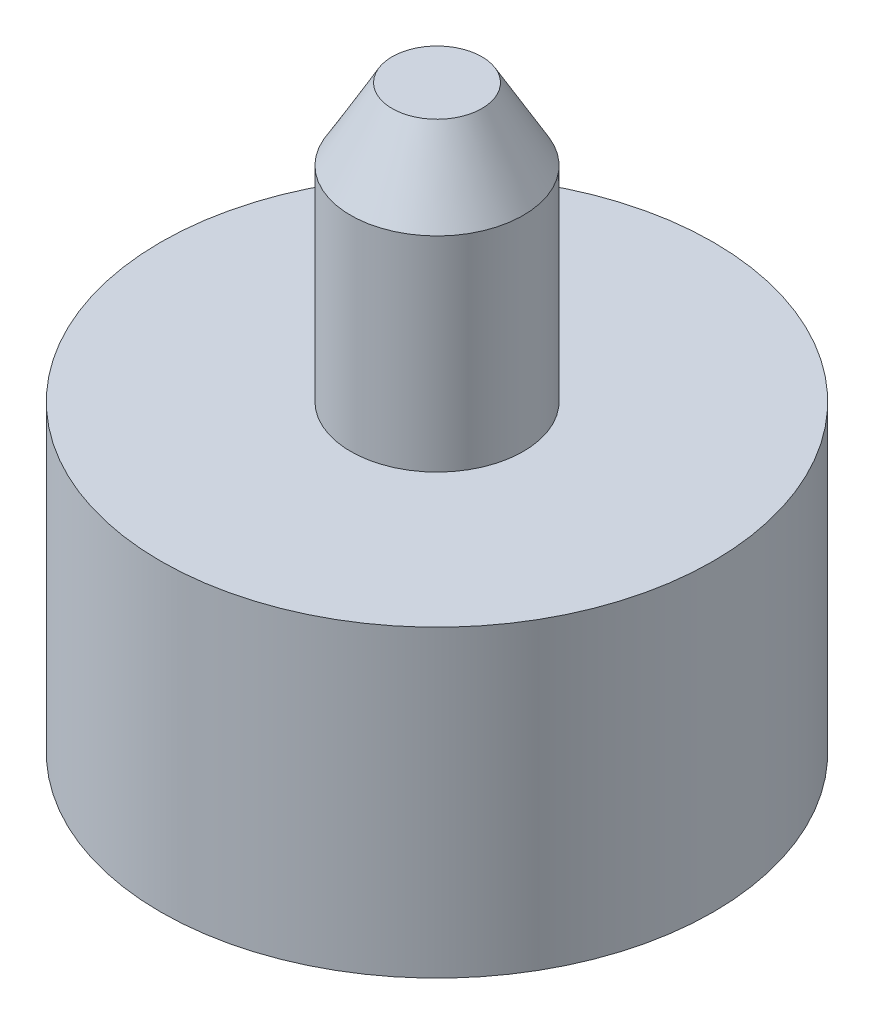
ISO-10303-21;
HEADER;
FILE_DESCRIPTION(('STEP AP214'),'2;1');
FILE_NAME('part.step','',(''),(''),'','','');
FILE_SCHEMA(('AUTOMOTIVE_DESIGN { 1 0 10303 214 1 1 1 1 }'));
ENDSEC;
DATA;
#1=APPLICATION_CONTEXT('core data for automotive mechanical design processes');
#2=APPLICATION_PROTOCOL_DEFINITION('international standard','automotive_design',2000,#1);
#3=PRODUCT_CONTEXT('',#1,'mechanical');
#4=PRODUCT('Part','Part','',(#3));
#5=PRODUCT_RELATED_PRODUCT_CATEGORY('part','',(#4));
#6=PRODUCT_DEFINITION_FORMATION('','',#4);
#7=PRODUCT_DEFINITION_CONTEXT('part definition',#1,'design');
#8=PRODUCT_DEFINITION('design','',#6,#7);
#9=PRODUCT_DEFINITION_SHAPE('','',#8);
#10=(LENGTH_UNIT() NAMED_UNIT(*) SI_UNIT(.MILLI.,.METRE.));
#11=(NAMED_UNIT(*) PLANE_ANGLE_UNIT() SI_UNIT($,.RADIAN.));
#12=(NAMED_UNIT(*) SI_UNIT($,.STERADIAN.) SOLID_ANGLE_UNIT());
#13=UNCERTAINTY_MEASURE_WITH_UNIT(LENGTH_MEASURE(1.E-05),#10,'distance_accuracy_value','');
#14=(GEOMETRIC_REPRESENTATION_CONTEXT(3) GLOBAL_UNCERTAINTY_ASSIGNED_CONTEXT((#13)) GLOBAL_UNIT_ASSIGNED_CONTEXT((#10,
#11,#12)) REPRESENTATION_CONTEXT('',''));
#15=CARTESIAN_POINT('',(0.,0.,0.));
#16=DIRECTION('',(0.,0.,1.));
#17=DIRECTION('',(1.,0.,0.));
#18=AXIS2_PLACEMENT_3D('',#15,#16,#17);
#19=CARTESIAN_POINT('',(0.,44.,0.));
#20=DIRECTION('',(0.,-1.,0.));
#21=DIRECTION('',(0.,0.,-1.));
#22=AXIS2_PLACEMENT_3D('',#19,#20,#21);
#23=CYLINDRICAL_SURFACE('',#22,40.);
#24=CARTESIAN_POINT('',(0.,44.,0.));
#25=DIRECTION('',(0.,1.,0.));
#26=DIRECTION('',(0.,0.,1.));
#27=AXIS2_PLACEMENT_3D('',#24,#25,#26);
#28=CIRCLE('',#27,40.);
#29=CARTESIAN_POINT('',(0.,44.,40.));
#30=VERTEX_POINT('',#29);
#31=EDGE_CURVE('E47',#30,#30,#28,.T.);
#32=ORIENTED_EDGE('',*,*,#31,.F.);
#33=EDGE_LOOP('',(#32));
#34=FACE_BOUND('',#33,.T.);
#35=CARTESIAN_POINT('',(0.,0.,0.));
#36=DIRECTION('',(0.,1.,0.));
#37=DIRECTION('',(0.,0.,1.));
#38=AXIS2_PLACEMENT_3D('',#35,#36,#37);
#39=CIRCLE('',#38,40.);
#40=CARTESIAN_POINT('',(0.,0.,40.));
#41=VERTEX_POINT('',#40);
#42=EDGE_CURVE('E50',#41,#41,#39,.T.);
#43=ORIENTED_EDGE('',*,*,#42,.T.);
#44=EDGE_LOOP('',(#43));
#45=FACE_BOUND('',#44,.T.);
#46=ADVANCED_FACE('F32',(#34,#45),#23,.T.);
#47=CARTESIAN_POINT('',(0.,44.,0.));
#48=DIRECTION('',(0.,1.,0.));
#49=DIRECTION('',(0.,0.,1.));
#50=AXIS2_PLACEMENT_3D('',#47,#48,#49);
#51=PLANE('',#50);
#52=CARTESIAN_POINT('',(0.,44.,0.));
#53=DIRECTION('',(0.,1.,0.));
#54=DIRECTION('',(0.,0.,1.));
#55=AXIS2_PLACEMENT_3D('',#52,#53,#54);
#56=CIRCLE('',#55,12.5);
#57=CARTESIAN_POINT('',(0.,44.,-12.5));
#58=VERTEX_POINT('',#57);
#59=EDGE_CURVE('E43',#58,#58,#56,.T.);
#60=ORIENTED_EDGE('',*,*,#59,.F.);
#61=EDGE_LOOP('',(#60));
#62=FACE_BOUND('',#61,.T.);
#63=ORIENTED_EDGE('',*,*,#31,.T.);
#64=EDGE_LOOP('',(#63));
#65=FACE_BOUND('',#64,.T.);
#66=ADVANCED_FACE('F56',(#62,#65),#51,.T.);
#67=CARTESIAN_POINT('',(0.,0.,0.));
#68=DIRECTION('',(0.,1.,0.));
#69=DIRECTION('',(0.,0.,1.));
#70=AXIS2_PLACEMENT_3D('',#67,#68,#69);
#71=PLANE('',#70);
#72=ORIENTED_EDGE('',*,*,#42,.F.);
#73=EDGE_LOOP('',(#72));
#74=FACE_BOUND('',#73,.T.);
#75=ADVANCED_FACE('F62',(#74),#71,.F.);
#76=CARTESIAN_POINT('',(0.,84.,0.));
#77=DIRECTION('',(0.,-1.,0.));
#78=DIRECTION('',(0.,0.,-1.));
#79=AXIS2_PLACEMENT_3D('',#76,#77,#78);
#80=CYLINDRICAL_SURFACE('',#79,12.5);
#81=CARTESIAN_POINT('',(0.,73.6076951545867,0.));
#82=DIRECTION('',(0.,-1.,0.));
#83=DIRECTION('',(0.,0.,-1.));
#84=AXIS2_PLACEMENT_3D('',#81,#82,#83);
#85=CIRCLE('',#84,12.5);
#86=CARTESIAN_POINT('',(0.,73.6076951545867,-12.5));
#87=VERTEX_POINT('',#86);
#88=EDGE_CURVE('E39',#87,#87,#85,.T.);
#89=CARTESIAN_POINT('',(0.,73.6076951545867,-12.5));
#90=CARTESIAN_POINT('',(0.,73.2992816633931,-12.5));
#91=CARTESIAN_POINT('',(0.,72.9908681721995,-12.5));
#92=CARTESIAN_POINT('',(0.,72.3740411898122,-12.5));
#93=CARTESIAN_POINT('',(0.,72.0656276986186,-12.5));
#94=CARTESIAN_POINT('',(0.,71.4488007162314,-12.5));
#95=CARTESIAN_POINT('',(0.,71.1403872250378,-12.5));
#96=CARTESIAN_POINT('',(0.,70.5235602426506,-12.5));
#97=CARTESIAN_POINT('',(0.,70.215146751457,-12.5));
#98=CARTESIAN_POINT('',(0.,69.5983197690698,-12.5));
#99=CARTESIAN_POINT('',(0.,69.2899062778761,-12.5));
#100=CARTESIAN_POINT('',(0.,68.6730792954889,-12.5));
#101=CARTESIAN_POINT('',(0.,68.3646658042953,-12.5));
#102=CARTESIAN_POINT('',(0.,67.7478388219081,-12.5));
#103=CARTESIAN_POINT('',(0.,67.4394253307145,-12.5));
#104=CARTESIAN_POINT('',(0.,66.8225983483272,-12.5));
#105=CARTESIAN_POINT('',(0.,66.5141848571336,-12.5));
#106=CARTESIAN_POINT('',(0.,65.8973578747464,-12.5));
#107=CARTESIAN_POINT('',(0.,65.5889443835528,-12.5));
#108=CARTESIAN_POINT('',(0.,64.9721174011656,-12.5));
#109=CARTESIAN_POINT('',(0.,64.663703909972,-12.5));
#110=CARTESIAN_POINT('',(0.,64.0468769275847,-12.5));
#111=CARTESIAN_POINT('',(0.,63.7384634363911,-12.5));
#112=CARTESIAN_POINT('',(0.,63.1216364540039,-12.5));
#113=CARTESIAN_POINT('',(0.,62.8132229628103,-12.5));
#114=CARTESIAN_POINT('',(0.,62.1963959804231,-12.5));
#115=CARTESIAN_POINT('',(0.,61.8879824892295,-12.5));
#116=CARTESIAN_POINT('',(0.,61.2711555068422,-12.5));
#117=CARTESIAN_POINT('',(0.,60.9627420156486,-12.5));
#118=CARTESIAN_POINT('',(0.,60.3459150332614,-12.5));
#119=CARTESIAN_POINT('',(0.,60.0375015420678,-12.5));
#120=CARTESIAN_POINT('',(0.,59.4206745596806,-12.5));
#121=CARTESIAN_POINT('',(0.,59.112261068487,-12.5));
#122=CARTESIAN_POINT('',(0.,58.4954340860997,-12.5));
#123=CARTESIAN_POINT('',(0.,58.1870205949061,-12.5));
#124=CARTESIAN_POINT('',(0.,57.5701936125189,-12.5));
#125=CARTESIAN_POINT('',(0.,57.2617801213253,-12.5));
#126=CARTESIAN_POINT('',(0.,56.6449531389381,-12.5));
#127=CARTESIAN_POINT('',(0.,56.3365396477445,-12.5));
#128=CARTESIAN_POINT('',(0.,55.7197126653572,-12.5));
#129=CARTESIAN_POINT('',(0.,55.4112991741636,-12.5));
#130=CARTESIAN_POINT('',(0.,54.7944721917764,-12.5));
#131=CARTESIAN_POINT('',(0.,54.4860587005828,-12.5));
#132=CARTESIAN_POINT('',(0.,53.8692317181956,-12.5));
#133=CARTESIAN_POINT('',(0.,53.5608182270019,-12.5));
#134=CARTESIAN_POINT('',(0.,52.9439912446147,-12.5));
#135=CARTESIAN_POINT('',(0.,52.6355777534211,-12.5));
#136=CARTESIAN_POINT('',(0.,52.0187507710339,-12.5));
#137=CARTESIAN_POINT('',(0.,51.7103372798403,-12.5));
#138=CARTESIAN_POINT('',(0.,51.0935102974531,-12.5));
#139=CARTESIAN_POINT('',(0.,50.7850968062595,-12.5));
#140=CARTESIAN_POINT('',(0.,50.1682698238722,-12.5));
#141=CARTESIAN_POINT('',(0.,49.8598563326786,-12.5));
#142=CARTESIAN_POINT('',(0.,49.2430293502914,-12.5));
#143=CARTESIAN_POINT('',(0.,48.9346158590978,-12.5));
#144=CARTESIAN_POINT('',(0.,48.3177888767106,-12.5));
#145=CARTESIAN_POINT('',(0.,48.0093753855169,-12.5));
#146=CARTESIAN_POINT('',(0.,47.3925484031297,-12.5));
#147=CARTESIAN_POINT('',(0.,47.0841349119361,-12.5));
#148=CARTESIAN_POINT('',(0.,46.4673079295489,-12.5));
#149=CARTESIAN_POINT('',(0.,46.1588944383553,-12.5));
#150=CARTESIAN_POINT('',(0.,45.542067455968,-12.5));
#151=CARTESIAN_POINT('',(0.,45.2336539647744,-12.5));
#152=CARTESIAN_POINT('',(0.,44.6168269823872,-12.5));
#153=CARTESIAN_POINT('',(0.,44.3084134911936,-12.5));
#154=CARTESIAN_POINT('',(0.,44.,-12.5));
#155=B_SPLINE_CURVE_WITH_KNOTS('',3,(#89,#90,#91,#92,#93,#94,#95,#96,#97,#98,#99,#100,#101,#102,
#103,#104,#105,#106,#107,#108,#109,#110,#111,#112,#113,#114,#115,#116,#117,#118,#119,#120,#121,
#122,#123,#124,#125,#126,#127,#128,#129,#130,#131,#132,#133,#134,#135,#136,#137,#138,#139,#140,
#141,#142,#143,#144,#145,#146,#147,#148,#149,#150,#151,#152,#153,#154),.UNSPECIFIED.,.F.,.F.,(4,
2,2,2,2,2,2,2,2,2,2,2,2,2,2,2,2,2,2,2,2,2,2,2,2,2,2,2,2,2,2,2,4),(0.,0.925240473580835,
1.85048094716167,2.77572142074251,3.70096189432333,4.62620236790416,5.551442841485,
6.47668331506583,7.40192378864667,8.3271642622275,9.25240473580834,10.1776452093892,
11.10288568297,12.0281261565508,12.9533666301317,13.8786071037125,14.8038475772933,
15.7290880508742,16.654328524455,17.5795689980359,18.5048094716167,19.4300499451975,
20.3552904187784,21.2805308923592,22.20577136594,23.1310118395209,24.0562523131017,
24.9814927866825,25.9067332602634,26.8319737338442,27.757214207425,28.6824546810059,
29.6076951545867),.UNSPECIFIED.);
#156=EDGE_CURVE('BSEAM64',#87,#58,#155,.T.);
#157=ORIENTED_EDGE('',*,*,#88,.T.);
#158=ORIENTED_EDGE('',*,*,#59,.T.);
#159=ORIENTED_EDGE('',*,*,#156,.T.);
#160=ORIENTED_EDGE('',*,*,#156,.F.);
#161=EDGE_LOOP('',(#157,#159,#158,#160));
#162=FACE_BOUND('',#161,.T.);
#163=ADVANCED_FACE('F64',(#162),#80,.T.);
#164=CARTESIAN_POINT('',(0.,84.,0.));
#165=DIRECTION('',(0.,-1.,0.));
#166=DIRECTION('',(0.,0.,-1.));
#167=AXIS2_PLACEMENT_3D('',#164,#165,#166);
#168=PLANE('',#167);
#169=CARTESIAN_POINT('',(0.,84.,0.));
#170=DIRECTION('',(0.,-1.,0.));
#171=DIRECTION('',(0.,0.,-1.));
#172=AXIS2_PLACEMENT_3D('',#169,#170,#171);
#173=CIRCLE('',#172,6.49999999999995);
#174=CARTESIAN_POINT('',(0.,84.,-6.49999999999995));
#175=VERTEX_POINT('',#174);
#176=EDGE_CURVE('E10',#175,#175,#173,.F.);
#177=ORIENTED_EDGE('',*,*,#176,.T.);
#178=EDGE_LOOP('',(#177));
#179=FACE_BOUND('',#178,.T.);
#180=ADVANCED_FACE('F70',(#179),#168,.F.);
#181=CARTESIAN_POINT('',(0.,73.6076951545867,0.));
#182=DIRECTION('',(0.,-1.,0.));
#183=DIRECTION('',(0.,0.,-1.));
#184=AXIS2_PLACEMENT_3D('',#181,#182,#183);
#185=CONICAL_SURFACE('',#184,12.5,0.523598775598301);
#186=ORIENTED_EDGE('',*,*,#176,.F.);
#187=EDGE_LOOP('',(#186));
#188=FACE_BOUND('',#187,.T.);
#189=ORIENTED_EDGE('',*,*,#88,.F.);
#190=EDGE_LOOP('',(#189));
#191=FACE_BOUND('',#190,.T.);
#192=ADVANCED_FACE('F34',(#188,#191),#185,.T.);
#193=CLOSED_SHELL('',(#46,#66,#75,#163,#180,#192));
#194=MANIFOLD_SOLID_BREP('B2',#193);
#195=ADVANCED_BREP_SHAPE_REPRESENTATION('',(#18,#194),#14);
#196=SHAPE_DEFINITION_REPRESENTATION(#9,#195);
ENDSEC;
END-ISO-10303-21;
